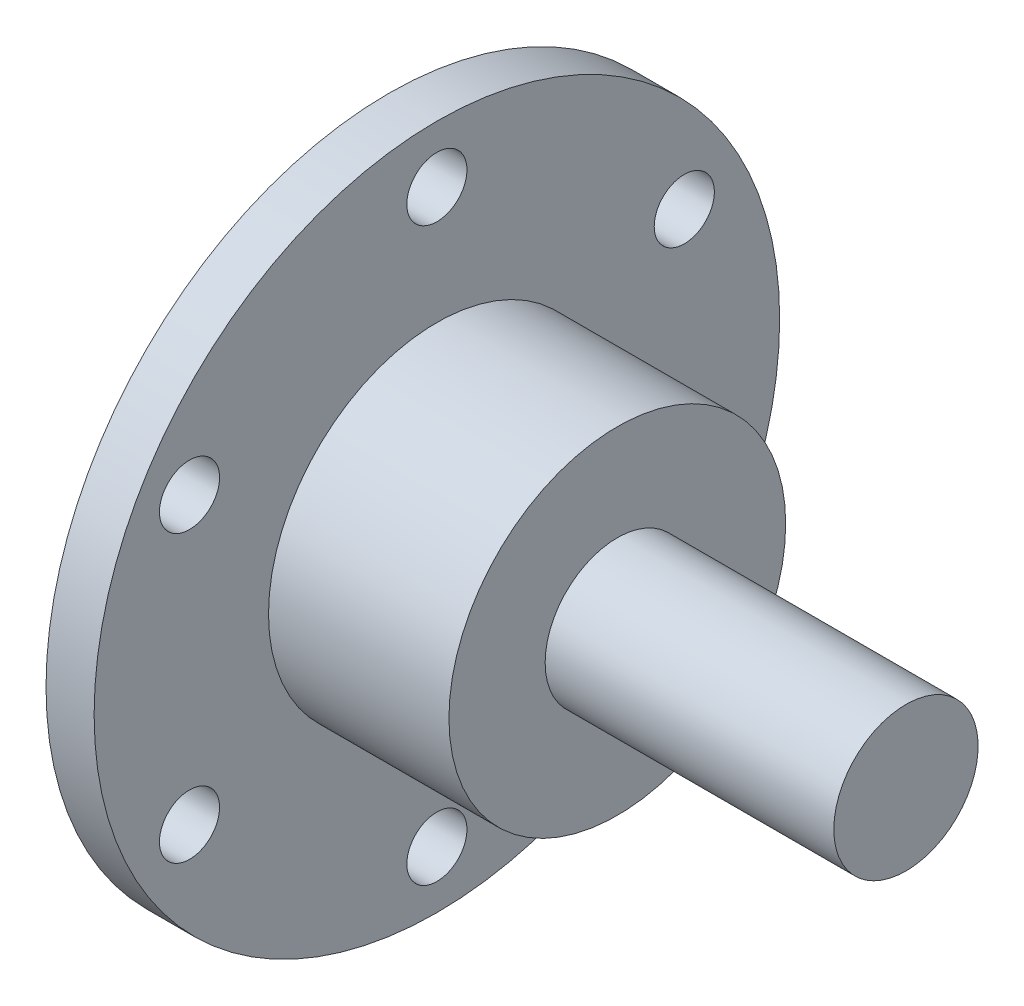
ISO-10303-21;
HEADER;
FILE_DESCRIPTION(('STEP AP214'),'2;1');
FILE_NAME('part.step','',(''),(''),'','','');
FILE_SCHEMA(('AUTOMOTIVE_DESIGN { 1 0 10303 214 1 1 1 1 }'));
ENDSEC;
DATA;
#1=APPLICATION_CONTEXT('core data for automotive mechanical design processes');
#2=APPLICATION_PROTOCOL_DEFINITION('international standard','automotive_design',2000,#1);
#3=PRODUCT_CONTEXT('',#1,'mechanical');
#4=PRODUCT('Part','Part','',(#3));
#5=PRODUCT_RELATED_PRODUCT_CATEGORY('part','',(#4));
#6=PRODUCT_DEFINITION_FORMATION('','',#4);
#7=PRODUCT_DEFINITION_CONTEXT('part definition',#1,'design');
#8=PRODUCT_DEFINITION('design','',#6,#7);
#9=PRODUCT_DEFINITION_SHAPE('','',#8);
#10=(LENGTH_UNIT() NAMED_UNIT(*) SI_UNIT(.MILLI.,.METRE.));
#11=(NAMED_UNIT(*) PLANE_ANGLE_UNIT() SI_UNIT($,.RADIAN.));
#12=(NAMED_UNIT(*) SI_UNIT($,.STERADIAN.) SOLID_ANGLE_UNIT());
#13=UNCERTAINTY_MEASURE_WITH_UNIT(LENGTH_MEASURE(1.E-05),#10,'distance_accuracy_value','');
#14=(GEOMETRIC_REPRESENTATION_CONTEXT(3) GLOBAL_UNCERTAINTY_ASSIGNED_CONTEXT((#13)) GLOBAL_UNIT_ASSIGNED_CONTEXT((#10,
#11,#12)) REPRESENTATION_CONTEXT('',''));
#15=CARTESIAN_POINT('',(0.,0.,0.));
#16=DIRECTION('',(0.,0.,1.));
#17=DIRECTION('',(1.,0.,0.));
#18=AXIS2_PLACEMENT_3D('',#15,#16,#17);
#19=CARTESIAN_POINT('',(0.,0.,0.));
#20=DIRECTION('',(1.,0.,0.));
#21=DIRECTION('',(0.,0.,-1.));
#22=AXIS2_PLACEMENT_3D('',#19,#20,#21);
#23=PLANE('',#22);
#24=CARTESIAN_POINT('',(0.,23.75,0.));
#25=DIRECTION('',(-1.,0.,0.));
#26=DIRECTION('',(0.,0.,1.));
#27=AXIS2_PLACEMENT_3D('',#24,#25,#26);
#28=CIRCLE('',#27,2.5);
#29=CARTESIAN_POINT('',(0.,23.75,2.5));
#30=VERTEX_POINT('',#29);
#31=EDGE_CURVE('E107',#30,#30,#28,.T.);
#32=ORIENTED_EDGE('',*,*,#31,.F.);
#33=EDGE_LOOP('',(#32));
#34=FACE_BOUND('',#33,.T.);
#35=CARTESIAN_POINT('',(0.,11.875,-20.5681033398804));
#36=DIRECTION('',(-1.,0.,0.));
#37=DIRECTION('',(0.,0.,1.));
#38=AXIS2_PLACEMENT_3D('',#35,#36,#37);
#39=CIRCLE('',#38,2.5);
#40=CARTESIAN_POINT('',(0.,11.875,-18.0681033398804));
#41=VERTEX_POINT('',#40);
#42=EDGE_CURVE('E86',#41,#41,#39,.T.);
#43=ORIENTED_EDGE('',*,*,#42,.F.);
#44=EDGE_LOOP('',(#43));
#45=FACE_BOUND('',#44,.T.);
#46=CARTESIAN_POINT('',(0.,-11.875,-20.5681033398804));
#47=DIRECTION('',(-1.,0.,0.));
#48=DIRECTION('',(0.,0.,1.));
#49=AXIS2_PLACEMENT_3D('',#46,#47,#48);
#50=CIRCLE('',#49,2.5);
#51=CARTESIAN_POINT('',(0.,-11.875,-18.0681033398804));
#52=VERTEX_POINT('',#51);
#53=EDGE_CURVE('E77',#52,#52,#50,.T.);
#54=ORIENTED_EDGE('',*,*,#53,.F.);
#55=EDGE_LOOP('',(#54));
#56=FACE_BOUND('',#55,.T.);
#57=CARTESIAN_POINT('',(0.,-23.75,0.));
#58=DIRECTION('',(-1.,0.,0.));
#59=DIRECTION('',(0.,0.,1.));
#60=AXIS2_PLACEMENT_3D('',#57,#58,#59);
#61=CIRCLE('',#60,2.5);
#62=CARTESIAN_POINT('',(0.,-23.75,2.5));
#63=VERTEX_POINT('',#62);
#64=EDGE_CURVE('E87',#63,#63,#61,.T.);
#65=ORIENTED_EDGE('',*,*,#64,.F.);
#66=EDGE_LOOP('',(#65));
#67=FACE_BOUND('',#66,.T.);
#68=CARTESIAN_POINT('',(0.,-11.875,20.5681033398804));
#69=DIRECTION('',(-1.,0.,0.));
#70=DIRECTION('',(0.,0.,1.));
#71=AXIS2_PLACEMENT_3D('',#68,#69,#70);
#72=CIRCLE('',#71,2.5);
#73=CARTESIAN_POINT('',(0.,-11.875,23.0681033398804));
#74=VERTEX_POINT('',#73);
#75=EDGE_CURVE('E95',#74,#74,#72,.T.);
#76=ORIENTED_EDGE('',*,*,#75,.F.);
#77=EDGE_LOOP('',(#76));
#78=FACE_BOUND('',#77,.T.);
#79=CARTESIAN_POINT('',(0.,11.875,20.5681033398804));
#80=DIRECTION('',(-1.,0.,0.));
#81=DIRECTION('',(0.,0.,1.));
#82=AXIS2_PLACEMENT_3D('',#79,#80,#81);
#83=CIRCLE('',#82,2.5);
#84=CARTESIAN_POINT('',(0.,11.875,23.0681033398804));
#85=VERTEX_POINT('',#84);
#86=EDGE_CURVE('E103',#85,#85,#83,.T.);
#87=ORIENTED_EDGE('',*,*,#86,.F.);
#88=EDGE_LOOP('',(#87));
#89=FACE_BOUND('',#88,.T.);
#90=CARTESIAN_POINT('',(0.,0.,0.));
#91=DIRECTION('',(-1.,0.,0.));
#92=DIRECTION('',(0.,0.,1.));
#93=AXIS2_PLACEMENT_3D('',#90,#91,#92);
#94=CIRCLE('',#93,28.5);
#95=CARTESIAN_POINT('',(0.,0.,28.5));
#96=VERTEX_POINT('',#95);
#97=EDGE_CURVE('E10',#96,#96,#94,.T.);
#98=ORIENTED_EDGE('',*,*,#97,.T.);
#99=EDGE_LOOP('',(#98));
#100=FACE_BOUND('',#99,.T.);
#101=ADVANCED_FACE('F43',(#34,#45,#56,#67,#78,#89,#100),#23,.F.);
#102=CARTESIAN_POINT('',(-51.7043918918919,0.,0.));
#103=DIRECTION('',(-1.,0.,0.));
#104=DIRECTION('',(0.,0.,1.));
#105=AXIS2_PLACEMENT_3D('',#102,#103,#104);
#106=CYLINDRICAL_SURFACE('',#105,28.5);
#107=ORIENTED_EDGE('',*,*,#97,.F.);
#108=EDGE_LOOP('',(#107));
#109=FACE_BOUND('',#108,.T.);
#110=CARTESIAN_POINT('',(4.,0.,0.));
#111=DIRECTION('',(-1.,0.,0.));
#112=DIRECTION('',(0.,0.,1.));
#113=AXIS2_PLACEMENT_3D('',#110,#111,#112);
#114=CIRCLE('',#113,28.5);
#115=CARTESIAN_POINT('',(4.,0.,28.5));
#116=VERTEX_POINT('',#115);
#117=EDGE_CURVE('E50',#116,#116,#114,.T.);
#118=ORIENTED_EDGE('',*,*,#117,.T.);
#119=EDGE_LOOP('',(#118));
#120=FACE_BOUND('',#119,.T.);
#121=ADVANCED_FACE('F131',(#109,#120),#106,.T.);
#122=CARTESIAN_POINT('',(4.,0.,-28.5));
#123=DIRECTION('',(-1.,0.,0.));
#124=DIRECTION('',(0.,0.,1.));
#125=AXIS2_PLACEMENT_3D('',#122,#123,#124);
#126=PLANE('',#125);
#127=CARTESIAN_POINT('',(4.,23.75,0.));
#128=DIRECTION('',(-1.,0.,0.));
#129=DIRECTION('',(0.,0.,1.));
#130=AXIS2_PLACEMENT_3D('',#127,#128,#129);
#131=CIRCLE('',#130,2.5);
#132=CARTESIAN_POINT('',(4.,23.75,2.5));
#133=VERTEX_POINT('',#132);
#134=EDGE_CURVE('E76',#133,#133,#131,.F.);
#135=ORIENTED_EDGE('',*,*,#134,.F.);
#136=EDGE_LOOP('',(#135));
#137=FACE_BOUND('',#136,.T.);
#138=CARTESIAN_POINT('',(4.,11.875,-20.5681033398804));
#139=DIRECTION('',(-1.,0.,0.));
#140=DIRECTION('',(0.,0.,1.));
#141=AXIS2_PLACEMENT_3D('',#138,#139,#140);
#142=CIRCLE('',#141,2.5);
#143=CARTESIAN_POINT('',(4.,11.875,-18.0681033398804));
#144=VERTEX_POINT('',#143);
#145=EDGE_CURVE('E114',#144,#144,#142,.F.);
#146=ORIENTED_EDGE('',*,*,#145,.F.);
#147=EDGE_LOOP('',(#146));
#148=FACE_BOUND('',#147,.T.);
#149=CARTESIAN_POINT('',(4.,-11.875,-20.5681033398804));
#150=DIRECTION('',(-1.,0.,0.));
#151=DIRECTION('',(0.,0.,1.));
#152=AXIS2_PLACEMENT_3D('',#149,#150,#151);
#153=CIRCLE('',#152,2.5);
#154=CARTESIAN_POINT('',(4.,-11.875,-18.0681033398804));
#155=VERTEX_POINT('',#154);
#156=EDGE_CURVE('E82',#155,#155,#153,.F.);
#157=ORIENTED_EDGE('',*,*,#156,.F.);
#158=EDGE_LOOP('',(#157));
#159=FACE_BOUND('',#158,.T.);
#160=CARTESIAN_POINT('',(4.,-23.75,0.));
#161=DIRECTION('',(-1.,0.,0.));
#162=DIRECTION('',(0.,0.,1.));
#163=AXIS2_PLACEMENT_3D('',#160,#161,#162);
#164=CIRCLE('',#163,2.5);
#165=CARTESIAN_POINT('',(4.,-23.75,2.5));
#166=VERTEX_POINT('',#165);
#167=EDGE_CURVE('E81',#166,#166,#164,.F.);
#168=ORIENTED_EDGE('',*,*,#167,.F.);
#169=EDGE_LOOP('',(#168));
#170=FACE_BOUND('',#169,.T.);
#171=CARTESIAN_POINT('',(4.,-11.875,20.5681033398804));
#172=DIRECTION('',(-1.,0.,0.));
#173=DIRECTION('',(0.,0.,1.));
#174=AXIS2_PLACEMENT_3D('',#171,#172,#173);
#175=CIRCLE('',#174,2.5);
#176=CARTESIAN_POINT('',(4.,-11.875,23.0681033398804));
#177=VERTEX_POINT('',#176);
#178=EDGE_CURVE('E91',#177,#177,#175,.F.);
#179=ORIENTED_EDGE('',*,*,#178,.F.);
#180=EDGE_LOOP('',(#179));
#181=FACE_BOUND('',#180,.T.);
#182=CARTESIAN_POINT('',(4.,11.875,20.5681033398804));
#183=DIRECTION('',(-1.,0.,0.));
#184=DIRECTION('',(0.,0.,1.));
#185=AXIS2_PLACEMENT_3D('',#182,#183,#184);
#186=CIRCLE('',#185,2.5);
#187=CARTESIAN_POINT('',(4.,11.875,23.0681033398804));
#188=VERTEX_POINT('',#187);
#189=EDGE_CURVE('E99',#188,#188,#186,.F.);
#190=ORIENTED_EDGE('',*,*,#189,.F.);
#191=EDGE_LOOP('',(#190));
#192=FACE_BOUND('',#191,.T.);
#193=ORIENTED_EDGE('',*,*,#117,.F.);
#194=EDGE_LOOP('',(#193));
#195=FACE_BOUND('',#194,.T.);
#196=CARTESIAN_POINT('',(4.,0.,0.));
#197=DIRECTION('',(-1.,0.,0.));
#198=DIRECTION('',(0.,0.,1.));
#199=AXIS2_PLACEMENT_3D('',#196,#197,#198);
#200=CIRCLE('',#199,14.);
#201=CARTESIAN_POINT('',(4.,0.,14.));
#202=VERTEX_POINT('',#201);
#203=EDGE_CURVE('E56',#202,#202,#200,.T.);
#204=ORIENTED_EDGE('',*,*,#203,.T.);
#205=EDGE_LOOP('',(#204));
#206=FACE_BOUND('',#205,.T.);
#207=ADVANCED_FACE('F150',(#137,#148,#159,#170,#181,#192,#195,#206),#126,.F.);
#208=CARTESIAN_POINT('',(-51.7043918918919,0.,0.));
#209=DIRECTION('',(-1.,0.,0.));
#210=DIRECTION('',(0.,0.,1.));
#211=AXIS2_PLACEMENT_3D('',#208,#209,#210);
#212=CYLINDRICAL_SURFACE('',#211,14.);
#213=ORIENTED_EDGE('',*,*,#203,.F.);
#214=EDGE_LOOP('',(#213));
#215=FACE_BOUND('',#214,.T.);
#216=CARTESIAN_POINT('',(19.,0.,0.));
#217=DIRECTION('',(-1.,0.,0.));
#218=DIRECTION('',(0.,0.,1.));
#219=AXIS2_PLACEMENT_3D('',#216,#217,#218);
#220=CIRCLE('',#219,14.);
#221=CARTESIAN_POINT('',(19.,0.,14.));
#222=VERTEX_POINT('',#221);
#223=EDGE_CURVE('E62',#222,#222,#220,.T.);
#224=ORIENTED_EDGE('',*,*,#223,.T.);
#225=EDGE_LOOP('',(#224));
#226=FACE_BOUND('',#225,.T.);
#227=ADVANCED_FACE('F153',(#215,#226),#212,.T.);
#228=CARTESIAN_POINT('',(19.,0.,-14.));
#229=DIRECTION('',(-1.,0.,0.));
#230=DIRECTION('',(0.,0.,1.));
#231=AXIS2_PLACEMENT_3D('',#228,#229,#230);
#232=PLANE('',#231);
#233=ORIENTED_EDGE('',*,*,#223,.F.);
#234=EDGE_LOOP('',(#233));
#235=FACE_BOUND('',#234,.T.);
#236=CARTESIAN_POINT('',(19.,0.,0.));
#237=DIRECTION('',(-1.,0.,0.));
#238=DIRECTION('',(0.,0.,1.));
#239=AXIS2_PLACEMENT_3D('',#236,#237,#238);
#240=CIRCLE('',#239,6.);
#241=CARTESIAN_POINT('',(19.,0.,6.));
#242=VERTEX_POINT('',#241);
#243=EDGE_CURVE('E68',#242,#242,#240,.T.);
#244=ORIENTED_EDGE('',*,*,#243,.T.);
#245=EDGE_LOOP('',(#244));
#246=FACE_BOUND('',#245,.T.);
#247=ADVANCED_FACE('F161',(#235,#246),#232,.F.);
#248=CARTESIAN_POINT('',(-51.7043918918919,0.,0.));
#249=DIRECTION('',(-1.,0.,0.));
#250=DIRECTION('',(0.,0.,1.));
#251=AXIS2_PLACEMENT_3D('',#248,#249,#250);
#252=CYLINDRICAL_SURFACE('',#251,6.);
#253=ORIENTED_EDGE('',*,*,#243,.F.);
#254=EDGE_LOOP('',(#253));
#255=FACE_BOUND('',#254,.T.);
#256=CARTESIAN_POINT('',(43.,0.,0.));
#257=DIRECTION('',(-1.,0.,0.));
#258=DIRECTION('',(0.,0.,1.));
#259=AXIS2_PLACEMENT_3D('',#256,#257,#258);
#260=CIRCLE('',#259,6.);
#261=CARTESIAN_POINT('',(43.,0.,6.));
#262=VERTEX_POINT('',#261);
#263=EDGE_CURVE('E72',#262,#262,#260,.T.);
#264=ORIENTED_EDGE('',*,*,#263,.T.);
#265=EDGE_LOOP('',(#264));
#266=FACE_BOUND('',#265,.T.);
#267=ADVANCED_FACE('F167',(#255,#266),#252,.T.);
#268=CARTESIAN_POINT('',(43.,0.,-6.));
#269=DIRECTION('',(-1.,0.,0.));
#270=DIRECTION('',(0.,0.,1.));
#271=AXIS2_PLACEMENT_3D('',#268,#269,#270);
#272=PLANE('',#271);
#273=ORIENTED_EDGE('',*,*,#263,.F.);
#274=EDGE_LOOP('',(#273));
#275=FACE_BOUND('',#274,.T.);
#276=ADVANCED_FACE('F146',(#275),#272,.F.);
#277=CARTESIAN_POINT('',(43.001,11.875,20.5681033398804));
#278=DIRECTION('',(-1.,0.,0.));
#279=DIRECTION('',(0.,0.,1.));
#280=AXIS2_PLACEMENT_3D('',#277,#278,#279);
#281=CYLINDRICAL_SURFACE('',#280,2.5);
#282=ORIENTED_EDGE('',*,*,#86,.T.);
#283=EDGE_LOOP('',(#282));
#284=FACE_BOUND('',#283,.T.);
#285=ORIENTED_EDGE('',*,*,#189,.T.);
#286=EDGE_LOOP('',(#285));
#287=FACE_BOUND('',#286,.T.);
#288=ADVANCED_FACE('F142',(#284,#287),#281,.F.);
#289=CARTESIAN_POINT('',(43.001,-11.875,20.5681033398804));
#290=DIRECTION('',(-1.,0.,0.));
#291=DIRECTION('',(0.,0.,1.));
#292=AXIS2_PLACEMENT_3D('',#289,#290,#291);
#293=CYLINDRICAL_SURFACE('',#292,2.5);
#294=ORIENTED_EDGE('',*,*,#75,.T.);
#295=EDGE_LOOP('',(#294));
#296=FACE_BOUND('',#295,.T.);
#297=ORIENTED_EDGE('',*,*,#178,.T.);
#298=EDGE_LOOP('',(#297));
#299=FACE_BOUND('',#298,.T.);
#300=ADVANCED_FACE('F145',(#296,#299),#293,.F.);
#301=CARTESIAN_POINT('',(43.001,-23.75,0.));
#302=DIRECTION('',(-1.,0.,0.));
#303=DIRECTION('',(0.,0.,1.));
#304=AXIS2_PLACEMENT_3D('',#301,#302,#303);
#305=CYLINDRICAL_SURFACE('',#304,2.5);
#306=ORIENTED_EDGE('',*,*,#64,.T.);
#307=EDGE_LOOP('',(#306));
#308=FACE_BOUND('',#307,.T.);
#309=ORIENTED_EDGE('',*,*,#167,.T.);
#310=EDGE_LOOP('',(#309));
#311=FACE_BOUND('',#310,.T.);
#312=ADVANCED_FACE('F224',(#308,#311),#305,.F.);
#313=CARTESIAN_POINT('',(43.001,-11.875,-20.5681033398804));
#314=DIRECTION('',(-1.,0.,0.));
#315=DIRECTION('',(0.,0.,1.));
#316=AXIS2_PLACEMENT_3D('',#313,#314,#315);
#317=CYLINDRICAL_SURFACE('',#316,2.5);
#318=ORIENTED_EDGE('',*,*,#53,.T.);
#319=EDGE_LOOP('',(#318));
#320=FACE_BOUND('',#319,.T.);
#321=ORIENTED_EDGE('',*,*,#156,.T.);
#322=EDGE_LOOP('',(#321));
#323=FACE_BOUND('',#322,.T.);
#324=ADVANCED_FACE('F181',(#320,#323),#317,.F.);
#325=CARTESIAN_POINT('',(43.001,11.875,-20.5681033398804));
#326=DIRECTION('',(-1.,0.,0.));
#327=DIRECTION('',(0.,0.,1.));
#328=AXIS2_PLACEMENT_3D('',#325,#326,#327);
#329=CYLINDRICAL_SURFACE('',#328,2.5);
#330=ORIENTED_EDGE('',*,*,#42,.T.);
#331=EDGE_LOOP('',(#330));
#332=FACE_BOUND('',#331,.T.);
#333=ORIENTED_EDGE('',*,*,#145,.T.);
#334=EDGE_LOOP('',(#333));
#335=FACE_BOUND('',#334,.T.);
#336=ADVANCED_FACE('F242',(#332,#335),#329,.F.);
#337=CARTESIAN_POINT('',(43.001,23.75,0.));
#338=DIRECTION('',(-1.,0.,0.));
#339=DIRECTION('',(0.,0.,1.));
#340=AXIS2_PLACEMENT_3D('',#337,#338,#339);
#341=CYLINDRICAL_SURFACE('',#340,2.5);
#342=ORIENTED_EDGE('',*,*,#31,.T.);
#343=EDGE_LOOP('',(#342));
#344=FACE_BOUND('',#343,.T.);
#345=ORIENTED_EDGE('',*,*,#134,.T.);
#346=EDGE_LOOP('',(#345));
#347=FACE_BOUND('',#346,.T.);
#348=ADVANCED_FACE('F126',(#344,#347),#341,.F.);
#349=CLOSED_SHELL('',(#101,#121,#207,#227,#247,#267,#276,#288,#300,#312,#324,#336,#348));
#350=MANIFOLD_SOLID_BREP('B2',#349);
#351=ADVANCED_BREP_SHAPE_REPRESENTATION('',(#18,#350),#14);
#352=SHAPE_DEFINITION_REPRESENTATION(#9,#351);
ENDSEC;
END-ISO-10303-21;
